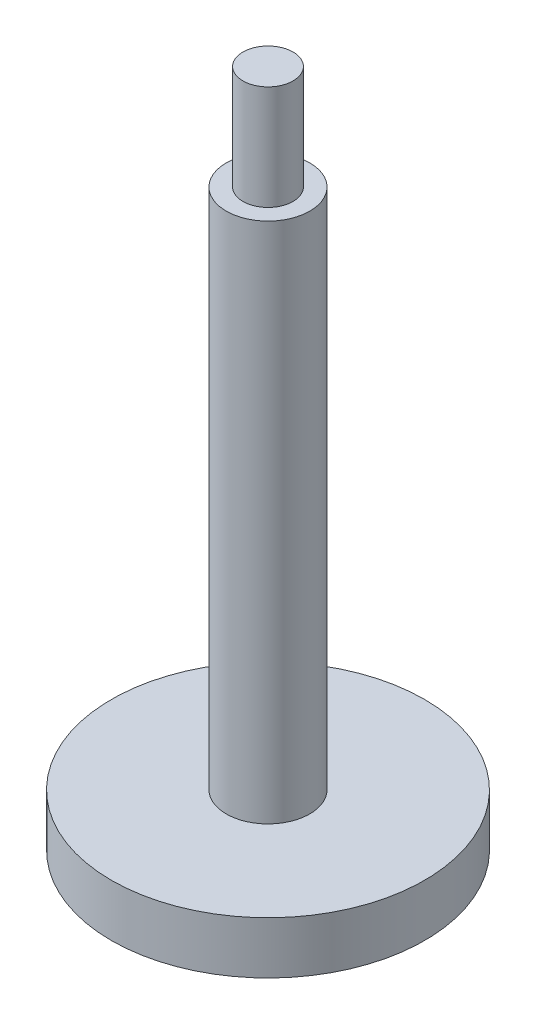
ISO-10303-21;
HEADER;
FILE_DESCRIPTION(('STEP AP214'),'2;1');
FILE_NAME('part.step','',(''),(''),'','','');
FILE_SCHEMA(('AUTOMOTIVE_DESIGN { 1 0 10303 214 1 1 1 1 }'));
ENDSEC;
DATA;
#1=APPLICATION_CONTEXT('core data for automotive mechanical design processes');
#2=APPLICATION_PROTOCOL_DEFINITION('international standard','automotive_design',2000,#1);
#3=PRODUCT_CONTEXT('',#1,'mechanical');
#4=PRODUCT('Part','Part','',(#3));
#5=PRODUCT_RELATED_PRODUCT_CATEGORY('part','',(#4));
#6=PRODUCT_DEFINITION_FORMATION('','',#4);
#7=PRODUCT_DEFINITION_CONTEXT('part definition',#1,'design');
#8=PRODUCT_DEFINITION('design','',#6,#7);
#9=PRODUCT_DEFINITION_SHAPE('','',#8);
#10=(LENGTH_UNIT() NAMED_UNIT(*) SI_UNIT(.MILLI.,.METRE.));
#11=(NAMED_UNIT(*) PLANE_ANGLE_UNIT() SI_UNIT($,.RADIAN.));
#12=(NAMED_UNIT(*) SI_UNIT($,.STERADIAN.) SOLID_ANGLE_UNIT());
#13=UNCERTAINTY_MEASURE_WITH_UNIT(LENGTH_MEASURE(1.E-05),#10,'distance_accuracy_value','');
#14=(GEOMETRIC_REPRESENTATION_CONTEXT(3) GLOBAL_UNCERTAINTY_ASSIGNED_CONTEXT((#13)) GLOBAL_UNIT_ASSIGNED_CONTEXT((#10,
#11,#12)) REPRESENTATION_CONTEXT('',''));
#15=CARTESIAN_POINT('',(0.,0.,0.));
#16=DIRECTION('',(0.,0.,1.));
#17=DIRECTION('',(1.,0.,0.));
#18=AXIS2_PLACEMENT_3D('',#15,#16,#17);
#19=CARTESIAN_POINT('',(0.,0.,0.));
#20=DIRECTION('',(0.,-1.,0.));
#21=DIRECTION('',(0.,0.,-1.));
#22=AXIS2_PLACEMENT_3D('',#19,#20,#21);
#23=PLANE('',#22);
#24=CARTESIAN_POINT('',(0.,0.,0.));
#25=DIRECTION('',(0.,-1.,0.));
#26=DIRECTION('',(0.,0.,-1.));
#27=AXIS2_PLACEMENT_3D('',#24,#25,#26);
#28=CIRCLE('',#27,2.4);
#29=CARTESIAN_POINT('',(0.,0.,-2.4));
#30=VERTEX_POINT('',#29);
#31=EDGE_CURVE('E10',#30,#30,#28,.T.);
#32=ORIENTED_EDGE('',*,*,#31,.F.);
#33=EDGE_LOOP('',(#32));
#34=FACE_BOUND('',#33,.T.);
#35=ADVANCED_FACE('F31',(#34),#23,.F.);
#36=CARTESIAN_POINT('',(0.,-65.,0.));
#37=DIRECTION('',(0.,-1.,0.));
#38=DIRECTION('',(0.,0.,-1.));
#39=AXIS2_PLACEMENT_3D('',#36,#37,#38);
#40=CYLINDRICAL_SURFACE('',#39,2.4);
#41=CARTESIAN_POINT('',(0.,-9.99999999999999,0.));
#42=DIRECTION('',(0.,-1.,0.));
#43=DIRECTION('',(0.,0.,-1.));
#44=AXIS2_PLACEMENT_3D('',#41,#42,#43);
#45=CIRCLE('',#44,2.4);
#46=CARTESIAN_POINT('',(0.,-9.99999999999999,-2.4));
#47=VERTEX_POINT('',#46);
#48=EDGE_CURVE('E37',#47,#47,#45,.T.);
#49=ORIENTED_EDGE('',*,*,#48,.F.);
#50=EDGE_LOOP('',(#49));
#51=FACE_BOUND('',#50,.T.);
#52=ORIENTED_EDGE('',*,*,#31,.T.);
#53=EDGE_LOOP('',(#52));
#54=FACE_BOUND('',#53,.T.);
#55=ADVANCED_FACE('F97',(#51,#54),#40,.T.);
#56=CARTESIAN_POINT('',(0.,-10.,2.4));
#57=DIRECTION('',(0.,-1.,0.));
#58=DIRECTION('',(0.,0.,-1.));
#59=AXIS2_PLACEMENT_3D('',#56,#57,#58);
#60=PLANE('',#59);
#61=CARTESIAN_POINT('',(0.,-10.,0.));
#62=DIRECTION('',(0.,-1.,0.));
#63=DIRECTION('',(0.,0.,-1.));
#64=AXIS2_PLACEMENT_3D('',#61,#62,#63);
#65=CIRCLE('',#64,4.00000000000002);
#66=CARTESIAN_POINT('',(0.,-10.,-4.00000000000002));
#67=VERTEX_POINT('',#66);
#68=EDGE_CURVE('E41',#67,#67,#65,.T.);
#69=ORIENTED_EDGE('',*,*,#68,.F.);
#70=EDGE_LOOP('',(#69));
#71=FACE_BOUND('',#70,.T.);
#72=ORIENTED_EDGE('',*,*,#48,.T.);
#73=EDGE_LOOP('',(#72));
#74=FACE_BOUND('',#73,.T.);
#75=ADVANCED_FACE('F92',(#71,#74),#60,.F.);
#76=CARTESIAN_POINT('',(0.,-65.,0.));
#77=DIRECTION('',(0.,-1.,0.));
#78=DIRECTION('',(0.,0.,-1.));
#79=AXIS2_PLACEMENT_3D('',#76,#77,#78);
#80=CYLINDRICAL_SURFACE('',#79,4.00000000000002);
#81=CARTESIAN_POINT('',(0.,-60.,0.));
#82=DIRECTION('',(0.,-1.,0.));
#83=DIRECTION('',(0.,0.,-1.));
#84=AXIS2_PLACEMENT_3D('',#81,#82,#83);
#85=CIRCLE('',#84,4.00000000000002);
#86=CARTESIAN_POINT('',(0.,-60.,-4.00000000000003));
#87=VERTEX_POINT('',#86);
#88=EDGE_CURVE('E45',#87,#87,#85,.T.);
#89=ORIENTED_EDGE('',*,*,#88,.F.);
#90=EDGE_LOOP('',(#89));
#91=FACE_BOUND('',#90,.T.);
#92=ORIENTED_EDGE('',*,*,#68,.T.);
#93=EDGE_LOOP('',(#92));
#94=FACE_BOUND('',#93,.T.);
#95=ADVANCED_FACE('F86',(#91,#94),#80,.T.);
#96=CARTESIAN_POINT('',(0.,-60.,4.00000000000001));
#97=DIRECTION('',(0.,-1.,0.));
#98=DIRECTION('',(0.,0.,-1.));
#99=AXIS2_PLACEMENT_3D('',#96,#97,#98);
#100=PLANE('',#99);
#101=CARTESIAN_POINT('',(0.,-60.,0.));
#102=DIRECTION('',(0.,-1.,0.));
#103=DIRECTION('',(0.,0.,-1.));
#104=AXIS2_PLACEMENT_3D('',#101,#102,#103);
#105=CIRCLE('',#104,15.);
#106=CARTESIAN_POINT('',(0.,-60.,-15.));
#107=VERTEX_POINT('',#106);
#108=EDGE_CURVE('E50',#107,#107,#105,.T.);
#109=ORIENTED_EDGE('',*,*,#108,.F.);
#110=EDGE_LOOP('',(#109));
#111=FACE_BOUND('',#110,.T.);
#112=ORIENTED_EDGE('',*,*,#88,.T.);
#113=EDGE_LOOP('',(#112));
#114=FACE_BOUND('',#113,.T.);
#115=ADVANCED_FACE('F80',(#111,#114),#100,.F.);
#116=CARTESIAN_POINT('',(0.,-65.,0.));
#117=DIRECTION('',(0.,-1.,0.));
#118=DIRECTION('',(0.,0.,-1.));
#119=AXIS2_PLACEMENT_3D('',#116,#117,#118);
#120=CYLINDRICAL_SURFACE('',#119,15.);
#121=CARTESIAN_POINT('',(0.,-65.,0.));
#122=DIRECTION('',(0.,-1.,0.));
#123=DIRECTION('',(0.,0.,-1.));
#124=AXIS2_PLACEMENT_3D('',#121,#122,#123);
#125=CIRCLE('',#124,15.);
#126=CARTESIAN_POINT('',(0.,-65.,-15.));
#127=VERTEX_POINT('',#126);
#128=EDGE_CURVE('E53',#127,#127,#125,.T.);
#129=ORIENTED_EDGE('',*,*,#128,.F.);
#130=EDGE_LOOP('',(#129));
#131=FACE_BOUND('',#130,.T.);
#132=ORIENTED_EDGE('',*,*,#108,.T.);
#133=EDGE_LOOP('',(#132));
#134=FACE_BOUND('',#133,.T.);
#135=ADVANCED_FACE('F74',(#131,#134),#120,.T.);
#136=CARTESIAN_POINT('',(0.,-65.,15.));
#137=DIRECTION('',(0.,1.,0.));
#138=DIRECTION('',(0.,0.,1.));
#139=AXIS2_PLACEMENT_3D('',#136,#137,#138);
#140=PLANE('',#139);
#141=CARTESIAN_POINT('',(0.,-65.,0.));
#142=DIRECTION('',(0.,-1.,0.));
#143=DIRECTION('',(0.,0.,-1.));
#144=AXIS2_PLACEMENT_3D('',#141,#142,#143);
#145=CIRCLE('',#144,1.35);
#146=CARTESIAN_POINT('',(0.,-65.,-1.35000000000001));
#147=VERTEX_POINT('',#146);
#148=EDGE_CURVE('E57',#147,#147,#145,.T.);
#149=ORIENTED_EDGE('',*,*,#148,.F.);
#150=EDGE_LOOP('',(#149));
#151=FACE_BOUND('',#150,.T.);
#152=ORIENTED_EDGE('',*,*,#128,.T.);
#153=EDGE_LOOP('',(#152));
#154=FACE_BOUND('',#153,.T.);
#155=ADVANCED_FACE('F68',(#151,#154),#140,.F.);
#156=CARTESIAN_POINT('',(0.,-45.,0.));
#157=DIRECTION('',(0.,-1.,0.));
#158=DIRECTION('',(0.,0.,-1.));
#159=AXIS2_PLACEMENT_3D('',#156,#157,#158);
#160=CYLINDRICAL_SURFACE('',#159,1.35);
#161=CARTESIAN_POINT('',(0.,-45.,0.));
#162=DIRECTION('',(0.,-1.,0.));
#163=DIRECTION('',(0.,0.,-1.));
#164=AXIS2_PLACEMENT_3D('',#161,#162,#163);
#165=CIRCLE('',#164,1.35);
#166=CARTESIAN_POINT('',(0.,-45.,-1.35000000000001));
#167=VERTEX_POINT('',#166);
#168=EDGE_CURVE('E56',#167,#167,#165,.T.);
#169=ORIENTED_EDGE('',*,*,#168,.F.);
#170=EDGE_LOOP('',(#169));
#171=FACE_BOUND('',#170,.T.);
#172=ORIENTED_EDGE('',*,*,#148,.T.);
#173=EDGE_LOOP('',(#172));
#174=FACE_BOUND('',#173,.T.);
#175=ADVANCED_FACE('F65',(#171,#174),#160,.F.);
#176=CARTESIAN_POINT('',(0.,-45.,0.));
#177=DIRECTION('',(0.,-1.,0.));
#178=DIRECTION('',(0.,0.,-1.));
#179=AXIS2_PLACEMENT_3D('',#176,#177,#178);
#180=PLANE('',#179);
#181=ORIENTED_EDGE('',*,*,#168,.T.);
#182=EDGE_LOOP('',(#181));
#183=FACE_BOUND('',#182,.T.);
#184=ADVANCED_FACE('F63',(#183),#180,.T.);
#185=CLOSED_SHELL('',(#35,#55,#75,#95,#115,#135,#155,#175,#184));
#186=MANIFOLD_SOLID_BREP('B2',#185);
#187=ADVANCED_BREP_SHAPE_REPRESENTATION('',(#18,#186),#14);
#188=SHAPE_DEFINITION_REPRESENTATION(#9,#187);
ENDSEC;
END-ISO-10303-21;
